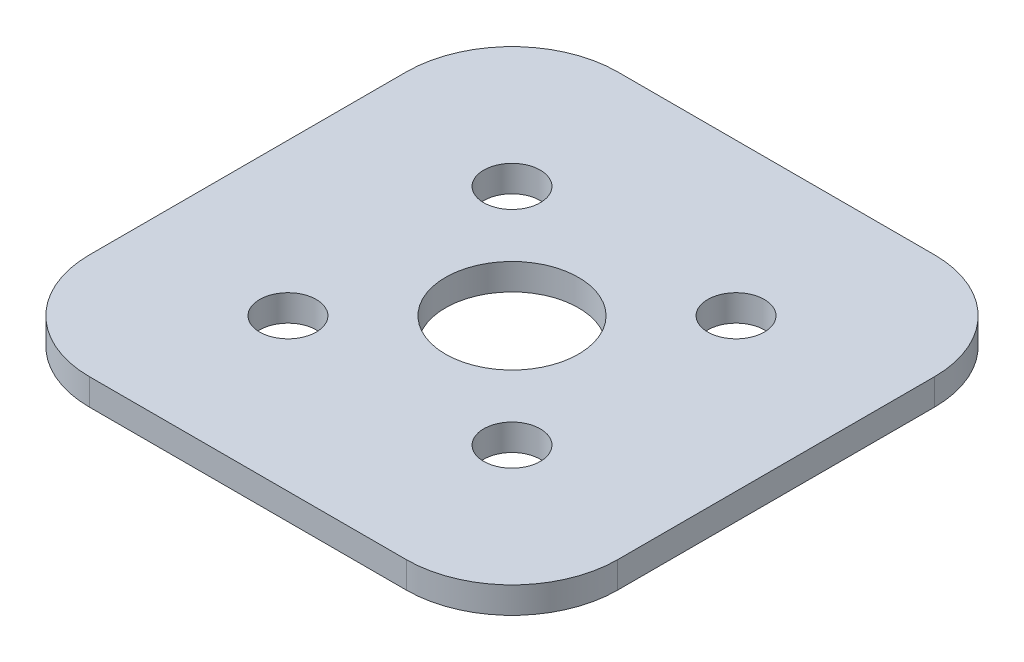
ISO-10303-21;
HEADER;
FILE_DESCRIPTION(('STEP AP214'),'2;1');
FILE_NAME('part.step','',(''),(''),'','','');
FILE_SCHEMA(('AUTOMOTIVE_DESIGN { 1 0 10303 214 1 1 1 1 }'));
ENDSEC;
DATA;
#1=APPLICATION_CONTEXT('core data for automotive mechanical design processes');
#2=APPLICATION_PROTOCOL_DEFINITION('international standard','automotive_design',2000,#1);
#3=PRODUCT_CONTEXT('',#1,'mechanical');
#4=PRODUCT('Part','Part','',(#3));
#5=PRODUCT_RELATED_PRODUCT_CATEGORY('part','',(#4));
#6=PRODUCT_DEFINITION_FORMATION('','',#4);
#7=PRODUCT_DEFINITION_CONTEXT('part definition',#1,'design');
#8=PRODUCT_DEFINITION('design','',#6,#7);
#9=PRODUCT_DEFINITION_SHAPE('','',#8);
#10=(LENGTH_UNIT() NAMED_UNIT(*) SI_UNIT(.MILLI.,.METRE.));
#11=(NAMED_UNIT(*) PLANE_ANGLE_UNIT() SI_UNIT($,.RADIAN.));
#12=(NAMED_UNIT(*) SI_UNIT($,.STERADIAN.) SOLID_ANGLE_UNIT());
#13=UNCERTAINTY_MEASURE_WITH_UNIT(LENGTH_MEASURE(1.E-05),#10,'distance_accuracy_value','');
#14=(GEOMETRIC_REPRESENTATION_CONTEXT(3) GLOBAL_UNCERTAINTY_ASSIGNED_CONTEXT((#13)) GLOBAL_UNIT_ASSIGNED_CONTEXT((#10,
#11,#12)) REPRESENTATION_CONTEXT('',''));
#15=CARTESIAN_POINT('',(0.,0.,0.));
#16=DIRECTION('',(0.,0.,1.));
#17=DIRECTION('',(1.,0.,0.));
#18=AXIS2_PLACEMENT_3D('',#15,#16,#17);
#19=CARTESIAN_POINT('',(-9.52499999999999,1.5875,-9.525));
#20=DIRECTION('',(0.,-1.,0.));
#21=DIRECTION('',(0.,0.,-1.));
#22=AXIS2_PLACEMENT_3D('',#19,#20,#21);
#23=PLANE('',#22);
#24=CARTESIAN_POINT('',(-9.52499999999999,1.5875,-9.525));
#25=DIRECTION('',(0.,1.,0.));
#26=DIRECTION('',(0.,0.,-1.));
#27=AXIS2_PLACEMENT_3D('',#24,#25,#26);
#28=CIRCLE('',#27,6.35);
#29=CARTESIAN_POINT('',(-9.52499999999995,1.5875,-15.875));
#30=VERTEX_POINT('',#29);
#31=CARTESIAN_POINT('',(-15.875,1.5875,-9.52499999999996));
#32=VERTEX_POINT('',#31);
#33=EDGE_CURVE('E169',#30,#32,#28,.T.);
#34=ORIENTED_EDGE('',*,*,#33,.T.);
#35=DIRECTION('',(0.,0.,1.));
#36=VECTOR('',#35,1.);
#37=CARTESIAN_POINT('',(-15.875,1.5875,9.52499999999996));
#38=LINE('',#37,#36);
#39=CARTESIAN_POINT('',(-15.875,1.5875,9.52499999999996));
#40=VERTEX_POINT('',#39);
#41=EDGE_CURVE('E105',#32,#40,#38,.T.);
#42=ORIENTED_EDGE('',*,*,#41,.T.);
#43=CARTESIAN_POINT('',(-9.52499999999999,1.5875,9.525));
#44=DIRECTION('',(0.,1.,0.));
#45=DIRECTION('',(0.,0.,1.));
#46=AXIS2_PLACEMENT_3D('',#43,#44,#45);
#47=CIRCLE('',#46,6.35);
#48=CARTESIAN_POINT('',(-9.52499999999999,1.5875,15.875));
#49=VERTEX_POINT('',#48);
#50=EDGE_CURVE('E190',#40,#49,#47,.T.);
#51=ORIENTED_EDGE('',*,*,#50,.T.);
#52=DIRECTION('',(1.,0.,0.));
#53=VECTOR('',#52,1.);
#54=CARTESIAN_POINT('',(9.52499999999996,1.5875,15.875));
#55=LINE('',#54,#53);
#56=CARTESIAN_POINT('',(9.52499999999996,1.5875,15.875));
#57=VERTEX_POINT('',#56);
#58=EDGE_CURVE('E204',#49,#57,#55,.T.);
#59=ORIENTED_EDGE('',*,*,#58,.T.);
#60=CARTESIAN_POINT('',(9.52500000000001,1.5875,9.525));
#61=DIRECTION('',(0.,1.,0.));
#62=DIRECTION('',(0.,0.,1.));
#63=AXIS2_PLACEMENT_3D('',#60,#61,#62);
#64=CIRCLE('',#63,6.35);
#65=CARTESIAN_POINT('',(15.875,1.5875,9.52499999999996));
#66=VERTEX_POINT('',#65);
#67=EDGE_CURVE('E124',#57,#66,#64,.T.);
#68=ORIENTED_EDGE('',*,*,#67,.T.);
#69=DIRECTION('',(0.,0.,-1.));
#70=VECTOR('',#69,1.);
#71=CARTESIAN_POINT('',(15.875,1.5875,9.52499999999996));
#72=LINE('',#71,#70);
#73=CARTESIAN_POINT('',(15.875,1.5875,-9.52499999999996));
#74=VERTEX_POINT('',#73);
#75=EDGE_CURVE('E118',#66,#74,#72,.T.);
#76=ORIENTED_EDGE('',*,*,#75,.T.);
#77=CARTESIAN_POINT('',(9.52500000000001,1.5875,-9.525));
#78=DIRECTION('',(0.,1.,0.));
#79=DIRECTION('',(0.,0.,1.));
#80=AXIS2_PLACEMENT_3D('',#77,#78,#79);
#81=CIRCLE('',#80,6.35);
#82=CARTESIAN_POINT('',(9.52499999999997,1.5875,-15.875));
#83=VERTEX_POINT('',#82);
#84=EDGE_CURVE('E122',#74,#83,#81,.T.);
#85=ORIENTED_EDGE('',*,*,#84,.T.);
#86=DIRECTION('',(-1.,0.,0.));
#87=VECTOR('',#86,1.);
#88=CARTESIAN_POINT('',(9.52499999999997,1.5875,-15.875));
#89=LINE('',#88,#87);
#90=EDGE_CURVE('E62',#83,#30,#89,.T.);
#91=ORIENTED_EDGE('',*,*,#90,.T.);
#92=EDGE_LOOP('',(#34,#42,#51,#59,#68,#76,#85,#91));
#93=FACE_BOUND('',#92,.T.);
#94=CARTESIAN_POINT('',(0.,1.5875,0.));
#95=DIRECTION('',(0.,1.,0.));
#96=DIRECTION('',(0.,0.,1.));
#97=AXIS2_PLACEMENT_3D('',#94,#95,#96);
#98=CIRCLE('',#97,4.00000000000001);
#99=CARTESIAN_POINT('',(0.,1.5875,4.00000000000001));
#100=VERTEX_POINT('',#99);
#101=EDGE_CURVE('E151',#100,#100,#98,.T.);
#102=ORIENTED_EDGE('',*,*,#101,.F.);
#103=EDGE_LOOP('',(#102));
#104=FACE_BOUND('',#103,.T.);
#105=CARTESIAN_POINT('',(-6.73519209080186,1.5875,-6.73519209080188));
#106=DIRECTION('',(0.,1.,0.));
#107=DIRECTION('',(0.,0.,1.));
#108=AXIS2_PLACEMENT_3D('',#105,#106,#107);
#109=CIRCLE('',#108,1.700000029);
#110=CARTESIAN_POINT('',(-6.73519209080186,1.5875,-5.03519206180188));
#111=VERTEX_POINT('',#110);
#112=EDGE_CURVE('E218',#111,#111,#109,.T.);
#113=ORIENTED_EDGE('',*,*,#112,.F.);
#114=EDGE_LOOP('',(#113));
#115=FACE_BOUND('',#114,.T.);
#116=CARTESIAN_POINT('',(6.73519209080189,1.5875,-6.73519209080184));
#117=DIRECTION('',(0.,1.,0.));
#118=DIRECTION('',(0.,0.,1.));
#119=AXIS2_PLACEMENT_3D('',#116,#117,#118);
#120=CIRCLE('',#119,1.700000029);
#121=CARTESIAN_POINT('',(6.73519209080189,1.5875,-5.03519206180184));
#122=VERTEX_POINT('',#121);
#123=EDGE_CURVE('E226',#122,#122,#120,.T.);
#124=ORIENTED_EDGE('',*,*,#123,.F.);
#125=EDGE_LOOP('',(#124));
#126=FACE_BOUND('',#125,.T.);
#127=CARTESIAN_POINT('',(-6.73519209080189,1.5875,6.73519209080184));
#128=DIRECTION('',(0.,1.,0.));
#129=DIRECTION('',(0.,0.,1.));
#130=AXIS2_PLACEMENT_3D('',#127,#128,#129);
#131=CIRCLE('',#130,1.700000029);
#132=CARTESIAN_POINT('',(-6.73519209080189,1.5875,8.43519211980184));
#133=VERTEX_POINT('',#132);
#134=EDGE_CURVE('E234',#133,#133,#131,.T.);
#135=ORIENTED_EDGE('',*,*,#134,.F.);
#136=EDGE_LOOP('',(#135));
#137=FACE_BOUND('',#136,.T.);
#138=CARTESIAN_POINT('',(6.73519209080186,1.5875,6.73519209080187));
#139=DIRECTION('',(0.,1.,0.));
#140=DIRECTION('',(0.,0.,1.));
#141=AXIS2_PLACEMENT_3D('',#138,#139,#140);
#142=CIRCLE('',#141,1.700000029);
#143=CARTESIAN_POINT('',(6.73519209080186,1.5875,8.43519211980187));
#144=VERTEX_POINT('',#143);
#145=EDGE_CURVE('E242',#144,#144,#142,.T.);
#146=ORIENTED_EDGE('',*,*,#145,.F.);
#147=EDGE_LOOP('',(#146));
#148=FACE_BOUND('',#147,.T.);
#149=ADVANCED_FACE('F44',(#93,#104,#115,#126,#137,#148),#23,.F.);
#150=CARTESIAN_POINT('',(-9.52499999999999,0.,-9.525));
#151=DIRECTION('',(0.,-1.,0.));
#152=DIRECTION('',(0.,0.,-1.));
#153=AXIS2_PLACEMENT_3D('',#150,#151,#152);
#154=PLANE('',#153);
#155=CARTESIAN_POINT('',(-6.73519209080189,0.,6.73519209080184));
#156=DIRECTION('',(0.,1.,0.));
#157=DIRECTION('',(0.,0.,1.));
#158=AXIS2_PLACEMENT_3D('',#155,#156,#157);
#159=CIRCLE('',#158,1.700000029);
#160=CARTESIAN_POINT('',(-6.73519209080189,0.,8.43519211980184));
#161=VERTEX_POINT('',#160);
#162=EDGE_CURVE('E238',#161,#161,#159,.T.);
#163=ORIENTED_EDGE('',*,*,#162,.T.);
#164=EDGE_LOOP('',(#163));
#165=FACE_BOUND('',#164,.T.);
#166=CARTESIAN_POINT('',(-6.73519209080186,0.,-6.73519209080188));
#167=DIRECTION('',(0.,1.,0.));
#168=DIRECTION('',(0.,0.,1.));
#169=AXIS2_PLACEMENT_3D('',#166,#167,#168);
#170=CIRCLE('',#169,1.700000029);
#171=CARTESIAN_POINT('',(-6.73519209080186,0.,-5.03519206180188));
#172=VERTEX_POINT('',#171);
#173=EDGE_CURVE('E222',#172,#172,#170,.T.);
#174=ORIENTED_EDGE('',*,*,#173,.T.);
#175=EDGE_LOOP('',(#174));
#176=FACE_BOUND('',#175,.T.);
#177=CARTESIAN_POINT('',(-9.52499999999999,0.,-9.525));
#178=DIRECTION('',(0.,1.,0.));
#179=DIRECTION('',(0.,0.,-1.));
#180=AXIS2_PLACEMENT_3D('',#177,#178,#179);
#181=CIRCLE('',#180,6.35);
#182=CARTESIAN_POINT('',(-9.52499999999995,0.,-15.875));
#183=VERTEX_POINT('',#182);
#184=CARTESIAN_POINT('',(-15.875,0.,-9.52499999999996));
#185=VERTEX_POINT('',#184);
#186=EDGE_CURVE('E146',#183,#185,#181,.T.);
#187=ORIENTED_EDGE('',*,*,#186,.F.);
#188=DIRECTION('',(-1.,0.,0.));
#189=VECTOR('',#188,1.);
#190=CARTESIAN_POINT('',(9.52499999999997,0.,-15.875));
#191=LINE('',#190,#189);
#192=CARTESIAN_POINT('',(9.52499999999997,0.,-15.875));
#193=VERTEX_POINT('',#192);
#194=EDGE_CURVE('E97',#193,#183,#191,.T.);
#195=ORIENTED_EDGE('',*,*,#194,.F.);
#196=CARTESIAN_POINT('',(9.52500000000001,0.,-9.525));
#197=DIRECTION('',(0.,1.,0.));
#198=DIRECTION('',(0.,0.,1.));
#199=AXIS2_PLACEMENT_3D('',#196,#197,#198);
#200=CIRCLE('',#199,6.35);
#201=CARTESIAN_POINT('',(15.875,0.,-9.52499999999996));
#202=VERTEX_POINT('',#201);
#203=EDGE_CURVE('E91',#202,#193,#200,.T.);
#204=ORIENTED_EDGE('',*,*,#203,.F.);
#205=DIRECTION('',(0.,0.,-1.));
#206=VECTOR('',#205,1.);
#207=CARTESIAN_POINT('',(15.875,0.,9.52499999999996));
#208=LINE('',#207,#206);
#209=CARTESIAN_POINT('',(15.875,0.,9.52499999999996));
#210=VERTEX_POINT('',#209);
#211=EDGE_CURVE('E133',#210,#202,#208,.T.);
#212=ORIENTED_EDGE('',*,*,#211,.F.);
#213=CARTESIAN_POINT('',(9.52500000000001,0.,9.525));
#214=DIRECTION('',(0.,1.,0.));
#215=DIRECTION('',(0.,0.,1.));
#216=AXIS2_PLACEMENT_3D('',#213,#214,#215);
#217=CIRCLE('',#216,6.35);
#218=CARTESIAN_POINT('',(9.52499999999996,0.,15.875));
#219=VERTEX_POINT('',#218);
#220=EDGE_CURVE('E160',#219,#210,#217,.T.);
#221=ORIENTED_EDGE('',*,*,#220,.F.);
#222=DIRECTION('',(1.,0.,0.));
#223=VECTOR('',#222,1.);
#224=CARTESIAN_POINT('',(9.52499999999996,0.,15.875));
#225=LINE('',#224,#223);
#226=CARTESIAN_POINT('',(-9.52499999999999,0.,15.875));
#227=VERTEX_POINT('',#226);
#228=EDGE_CURVE('E157',#227,#219,#225,.T.);
#229=ORIENTED_EDGE('',*,*,#228,.F.);
#230=CARTESIAN_POINT('',(-9.52499999999999,0.,9.525));
#231=DIRECTION('',(0.,1.,0.));
#232=DIRECTION('',(0.,0.,1.));
#233=AXIS2_PLACEMENT_3D('',#230,#231,#232);
#234=CIRCLE('',#233,6.35);
#235=CARTESIAN_POINT('',(-15.875,0.,9.52499999999996));
#236=VERTEX_POINT('',#235);
#237=EDGE_CURVE('E154',#236,#227,#234,.T.);
#238=ORIENTED_EDGE('',*,*,#237,.F.);
#239=DIRECTION('',(0.,0.,1.));
#240=VECTOR('',#239,1.);
#241=CARTESIAN_POINT('',(-15.875,0.,9.52499999999996));
#242=LINE('',#241,#240);
#243=EDGE_CURVE('E150',#185,#236,#242,.T.);
#244=ORIENTED_EDGE('',*,*,#243,.F.);
#245=EDGE_LOOP('',(#187,#195,#204,#212,#221,#229,#238,#244));
#246=FACE_BOUND('',#245,.T.);
#247=CARTESIAN_POINT('',(0.,0.,0.));
#248=DIRECTION('',(0.,1.,0.));
#249=DIRECTION('',(0.,0.,1.));
#250=AXIS2_PLACEMENT_3D('',#247,#248,#249);
#251=CIRCLE('',#250,4.00000000000001);
#252=CARTESIAN_POINT('',(0.,0.,4.00000000000001));
#253=VERTEX_POINT('',#252);
#254=EDGE_CURVE('E214',#253,#253,#251,.T.);
#255=ORIENTED_EDGE('',*,*,#254,.T.);
#256=EDGE_LOOP('',(#255));
#257=FACE_BOUND('',#256,.T.);
#258=CARTESIAN_POINT('',(6.73519209080189,0.,-6.73519209080184));
#259=DIRECTION('',(0.,1.,0.));
#260=DIRECTION('',(0.,0.,1.));
#261=AXIS2_PLACEMENT_3D('',#258,#259,#260);
#262=CIRCLE('',#261,1.700000029);
#263=CARTESIAN_POINT('',(6.73519209080189,0.,-5.03519206180184));
#264=VERTEX_POINT('',#263);
#265=EDGE_CURVE('E230',#264,#264,#262,.T.);
#266=ORIENTED_EDGE('',*,*,#265,.T.);
#267=EDGE_LOOP('',(#266));
#268=FACE_BOUND('',#267,.T.);
#269=CARTESIAN_POINT('',(6.73519209080186,0.,6.73519209080187));
#270=DIRECTION('',(0.,1.,0.));
#271=DIRECTION('',(0.,0.,1.));
#272=AXIS2_PLACEMENT_3D('',#269,#270,#271);
#273=CIRCLE('',#272,1.700000029);
#274=CARTESIAN_POINT('',(6.73519209080186,0.,8.43519211980187));
#275=VERTEX_POINT('',#274);
#276=EDGE_CURVE('E246',#275,#275,#273,.T.);
#277=ORIENTED_EDGE('',*,*,#276,.T.);
#278=EDGE_LOOP('',(#277));
#279=FACE_BOUND('',#278,.T.);
#280=ADVANCED_FACE('F194',(#165,#176,#246,#257,#268,#279),#154,.T.);
#281=CARTESIAN_POINT('',(-9.52499999999999,1.5875,-9.525));
#282=DIRECTION('',(0.,-1.,0.));
#283=DIRECTION('',(0.,0.,-1.));
#284=AXIS2_PLACEMENT_3D('',#281,#282,#283);
#285=CYLINDRICAL_SURFACE('',#284,6.35);
#286=ORIENTED_EDGE('',*,*,#186,.T.);
#287=DIRECTION('',(0.,-1.,0.));
#288=VECTOR('',#287,1.);
#289=CARTESIAN_POINT('',(-15.875,1.5875,-9.52499999999996));
#290=LINE('',#289,#288);
#291=EDGE_CURVE('E11',#32,#185,#290,.T.);
#292=ORIENTED_EDGE('',*,*,#291,.F.);
#293=ORIENTED_EDGE('',*,*,#33,.F.);
#294=DIRECTION('',(0.,-1.,0.));
#295=VECTOR('',#294,1.);
#296=CARTESIAN_POINT('',(-9.52499999999995,1.5875,-15.875));
#297=LINE('',#296,#295);
#298=EDGE_CURVE('E142',#30,#183,#297,.T.);
#299=ORIENTED_EDGE('',*,*,#298,.T.);
#300=EDGE_LOOP('',(#286,#292,#293,#299));
#301=FACE_BOUND('',#300,.T.);
#302=ADVANCED_FACE('F46',(#301),#285,.T.);
#303=CARTESIAN_POINT('',(-15.875,1.5875,9.52499999999996));
#304=DIRECTION('',(1.,0.,0.));
#305=DIRECTION('',(0.,0.,-1.));
#306=AXIS2_PLACEMENT_3D('',#303,#304,#305);
#307=PLANE('',#306);
#308=ORIENTED_EDGE('',*,*,#243,.T.);
#309=DIRECTION('',(0.,-1.,0.));
#310=VECTOR('',#309,1.);
#311=CARTESIAN_POINT('',(-15.875,1.5875,9.52499999999996));
#312=LINE('',#311,#310);
#313=EDGE_CURVE('E54',#40,#236,#312,.T.);
#314=ORIENTED_EDGE('',*,*,#313,.F.);
#315=ORIENTED_EDGE('',*,*,#41,.F.);
#316=ORIENTED_EDGE('',*,*,#291,.T.);
#317=EDGE_LOOP('',(#308,#314,#315,#316));
#318=FACE_BOUND('',#317,.T.);
#319=ADVANCED_FACE('F280',(#318),#307,.F.);
#320=CARTESIAN_POINT('',(-9.52499999999999,1.5875,9.525));
#321=DIRECTION('',(0.,-1.,0.));
#322=DIRECTION('',(0.,0.,-1.));
#323=AXIS2_PLACEMENT_3D('',#320,#321,#322);
#324=CYLINDRICAL_SURFACE('',#323,6.35);
#325=ORIENTED_EDGE('',*,*,#237,.T.);
#326=DIRECTION('',(0.,-1.,0.));
#327=VECTOR('',#326,1.);
#328=CARTESIAN_POINT('',(-9.52499999999999,1.5875,15.875));
#329=LINE('',#328,#327);
#330=EDGE_CURVE('E180',#49,#227,#329,.T.);
#331=ORIENTED_EDGE('',*,*,#330,.F.);
#332=ORIENTED_EDGE('',*,*,#50,.F.);
#333=ORIENTED_EDGE('',*,*,#313,.T.);
#334=EDGE_LOOP('',(#325,#331,#332,#333));
#335=FACE_BOUND('',#334,.T.);
#336=ADVANCED_FACE('F188',(#335),#324,.T.);
#337=CARTESIAN_POINT('',(9.52499999999996,1.5875,15.875));
#338=DIRECTION('',(0.,0.,-1.));
#339=DIRECTION('',(-1.,0.,0.));
#340=AXIS2_PLACEMENT_3D('',#337,#338,#339);
#341=PLANE('',#340);
#342=ORIENTED_EDGE('',*,*,#228,.T.);
#343=DIRECTION('',(0.,-1.,0.));
#344=VECTOR('',#343,1.);
#345=CARTESIAN_POINT('',(9.52499999999996,1.5875,15.875));
#346=LINE('',#345,#344);
#347=EDGE_CURVE('E176',#57,#219,#346,.T.);
#348=ORIENTED_EDGE('',*,*,#347,.F.);
#349=ORIENTED_EDGE('',*,*,#58,.F.);
#350=ORIENTED_EDGE('',*,*,#330,.T.);
#351=EDGE_LOOP('',(#342,#348,#349,#350));
#352=FACE_BOUND('',#351,.T.);
#353=ADVANCED_FACE('F199',(#352),#341,.F.);
#354=CARTESIAN_POINT('',(9.52500000000001,1.5875,9.525));
#355=DIRECTION('',(0.,-1.,0.));
#356=DIRECTION('',(0.,0.,-1.));
#357=AXIS2_PLACEMENT_3D('',#354,#355,#356);
#358=CYLINDRICAL_SURFACE('',#357,6.35);
#359=ORIENTED_EDGE('',*,*,#220,.T.);
#360=DIRECTION('',(0.,-1.,0.));
#361=VECTOR('',#360,1.);
#362=CARTESIAN_POINT('',(15.875,1.5875,9.52499999999996));
#363=LINE('',#362,#361);
#364=EDGE_CURVE('E135',#66,#210,#363,.T.);
#365=ORIENTED_EDGE('',*,*,#364,.F.);
#366=ORIENTED_EDGE('',*,*,#67,.F.);
#367=ORIENTED_EDGE('',*,*,#347,.T.);
#368=EDGE_LOOP('',(#359,#365,#366,#367));
#369=FACE_BOUND('',#368,.T.);
#370=ADVANCED_FACE('F202',(#369),#358,.T.);
#371=CARTESIAN_POINT('',(15.875,1.5875,9.52499999999996));
#372=DIRECTION('',(-1.,0.,0.));
#373=DIRECTION('',(0.,0.,1.));
#374=AXIS2_PLACEMENT_3D('',#371,#372,#373);
#375=PLANE('',#374);
#376=ORIENTED_EDGE('',*,*,#211,.T.);
#377=DIRECTION('',(0.,-1.,0.));
#378=VECTOR('',#377,1.);
#379=CARTESIAN_POINT('',(15.875,1.5875,-9.52499999999996));
#380=LINE('',#379,#378);
#381=EDGE_CURVE('E130',#74,#202,#380,.T.);
#382=ORIENTED_EDGE('',*,*,#381,.F.);
#383=ORIENTED_EDGE('',*,*,#75,.F.);
#384=ORIENTED_EDGE('',*,*,#364,.T.);
#385=EDGE_LOOP('',(#376,#382,#383,#384));
#386=FACE_BOUND('',#385,.T.);
#387=ADVANCED_FACE('F131',(#386),#375,.F.);
#388=CARTESIAN_POINT('',(9.52500000000001,1.5875,-9.525));
#389=DIRECTION('',(0.,-1.,0.));
#390=DIRECTION('',(0.,0.,-1.));
#391=AXIS2_PLACEMENT_3D('',#388,#389,#390);
#392=CYLINDRICAL_SURFACE('',#391,6.35);
#393=ORIENTED_EDGE('',*,*,#203,.T.);
#394=DIRECTION('',(0.,-1.,0.));
#395=VECTOR('',#394,1.);
#396=CARTESIAN_POINT('',(9.52499999999997,1.5875,-15.875));
#397=LINE('',#396,#395);
#398=EDGE_CURVE('E136',#83,#193,#397,.T.);
#399=ORIENTED_EDGE('',*,*,#398,.F.);
#400=ORIENTED_EDGE('',*,*,#84,.F.);
#401=ORIENTED_EDGE('',*,*,#381,.T.);
#402=EDGE_LOOP('',(#393,#399,#400,#401));
#403=FACE_BOUND('',#402,.T.);
#404=ADVANCED_FACE('F138',(#403),#392,.T.);
#405=CARTESIAN_POINT('',(9.52499999999997,1.5875,-15.875));
#406=DIRECTION('',(0.,0.,1.));
#407=DIRECTION('',(1.,0.,0.));
#408=AXIS2_PLACEMENT_3D('',#405,#406,#407);
#409=PLANE('',#408);
#410=ORIENTED_EDGE('',*,*,#194,.T.);
#411=ORIENTED_EDGE('',*,*,#298,.F.);
#412=ORIENTED_EDGE('',*,*,#90,.F.);
#413=ORIENTED_EDGE('',*,*,#398,.T.);
#414=EDGE_LOOP('',(#410,#411,#412,#413));
#415=FACE_BOUND('',#414,.T.);
#416=ADVANCED_FACE('F268',(#415),#409,.F.);
#417=CARTESIAN_POINT('',(0.,1.5875,0.));
#418=DIRECTION('',(0.,-1.,0.));
#419=DIRECTION('',(0.,0.,-1.));
#420=AXIS2_PLACEMENT_3D('',#417,#418,#419);
#421=CYLINDRICAL_SURFACE('',#420,4.00000000000001);
#422=ORIENTED_EDGE('',*,*,#101,.T.);
#423=EDGE_LOOP('',(#422));
#424=FACE_BOUND('',#423,.T.);
#425=ORIENTED_EDGE('',*,*,#254,.F.);
#426=EDGE_LOOP('',(#425));
#427=FACE_BOUND('',#426,.T.);
#428=ADVANCED_FACE('F265',(#424,#427),#421,.F.);
#429=CARTESIAN_POINT('',(-6.73519209080186,1.5875,-6.73519209080188));
#430=DIRECTION('',(0.,-1.,0.));
#431=DIRECTION('',(0.,0.,-1.));
#432=AXIS2_PLACEMENT_3D('',#429,#430,#431);
#433=CYLINDRICAL_SURFACE('',#432,1.700000029);
#434=ORIENTED_EDGE('',*,*,#112,.T.);
#435=EDGE_LOOP('',(#434));
#436=FACE_BOUND('',#435,.T.);
#437=ORIENTED_EDGE('',*,*,#173,.F.);
#438=EDGE_LOOP('',(#437));
#439=FACE_BOUND('',#438,.T.);
#440=ADVANCED_FACE('F356',(#436,#439),#433,.F.);
#441=CARTESIAN_POINT('',(6.73519209080189,1.5875,-6.73519209080184));
#442=DIRECTION('',(0.,-1.,0.));
#443=DIRECTION('',(0.,0.,-1.));
#444=AXIS2_PLACEMENT_3D('',#441,#442,#443);
#445=CYLINDRICAL_SURFACE('',#444,1.700000029);
#446=ORIENTED_EDGE('',*,*,#123,.T.);
#447=EDGE_LOOP('',(#446));
#448=FACE_BOUND('',#447,.T.);
#449=ORIENTED_EDGE('',*,*,#265,.F.);
#450=EDGE_LOOP('',(#449));
#451=FACE_BOUND('',#450,.T.);
#452=ADVANCED_FACE('F365',(#448,#451),#445,.F.);
#453=CARTESIAN_POINT('',(-6.73519209080189,1.5875,6.73519209080184));
#454=DIRECTION('',(0.,-1.,0.));
#455=DIRECTION('',(0.,0.,-1.));
#456=AXIS2_PLACEMENT_3D('',#453,#454,#455);
#457=CYLINDRICAL_SURFACE('',#456,1.700000029);
#458=ORIENTED_EDGE('',*,*,#134,.T.);
#459=EDGE_LOOP('',(#458));
#460=FACE_BOUND('',#459,.T.);
#461=ORIENTED_EDGE('',*,*,#162,.F.);
#462=EDGE_LOOP('',(#461));
#463=FACE_BOUND('',#462,.T.);
#464=ADVANCED_FACE('F374',(#460,#463),#457,.F.);
#465=CARTESIAN_POINT('',(6.73519209080186,1.5875,6.73519209080187));
#466=DIRECTION('',(0.,-1.,0.));
#467=DIRECTION('',(0.,0.,-1.));
#468=AXIS2_PLACEMENT_3D('',#465,#466,#467);
#469=CYLINDRICAL_SURFACE('',#468,1.700000029);
#470=ORIENTED_EDGE('',*,*,#145,.T.);
#471=EDGE_LOOP('',(#470));
#472=FACE_BOUND('',#471,.T.);
#473=ORIENTED_EDGE('',*,*,#276,.F.);
#474=EDGE_LOOP('',(#473));
#475=FACE_BOUND('',#474,.T.);
#476=ADVANCED_FACE('F254',(#472,#475),#469,.F.);
#477=CLOSED_SHELL('',(#149,#280,#302,#319,#336,#353,#370,#387,#404,#416,#428,#440,#452,#464,#476));
#478=MANIFOLD_SOLID_BREP('B2',#477);
#479=ADVANCED_BREP_SHAPE_REPRESENTATION('',(#18,#478),#14);
#480=SHAPE_DEFINITION_REPRESENTATION(#9,#479);
ENDSEC;
END-ISO-10303-21;
